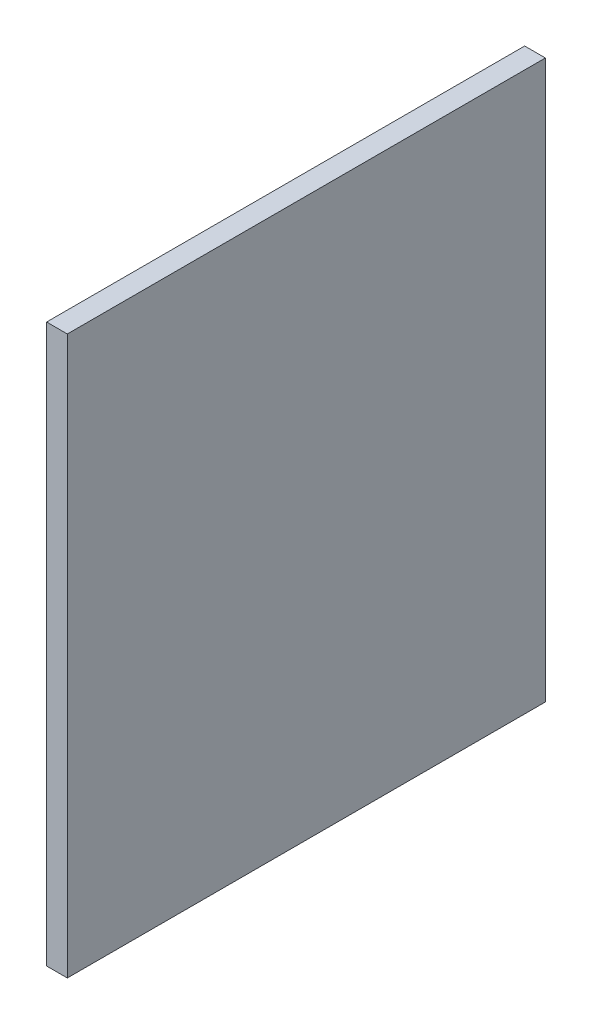
ISO-10303-21;
HEADER;
FILE_DESCRIPTION(('STEP AP214'),'2;1');
FILE_NAME('part.step','',(''),(''),'','','');
FILE_SCHEMA(('AUTOMOTIVE_DESIGN { 1 0 10303 214 1 1 1 1 }'));
ENDSEC;
DATA;
#1=APPLICATION_CONTEXT('core data for automotive mechanical design processes');
#2=APPLICATION_PROTOCOL_DEFINITION('international standard','automotive_design',2000,#1);
#3=PRODUCT_CONTEXT('',#1,'mechanical');
#4=PRODUCT('Part','Part','',(#3));
#5=PRODUCT_RELATED_PRODUCT_CATEGORY('part','',(#4));
#6=PRODUCT_DEFINITION_FORMATION('','',#4);
#7=PRODUCT_DEFINITION_CONTEXT('part definition',#1,'design');
#8=PRODUCT_DEFINITION('design','',#6,#7);
#9=PRODUCT_DEFINITION_SHAPE('','',#8);
#10=(LENGTH_UNIT() NAMED_UNIT(*) SI_UNIT(.MILLI.,.METRE.));
#11=(NAMED_UNIT(*) PLANE_ANGLE_UNIT() SI_UNIT($,.RADIAN.));
#12=(NAMED_UNIT(*) SI_UNIT($,.STERADIAN.) SOLID_ANGLE_UNIT());
#13=UNCERTAINTY_MEASURE_WITH_UNIT(LENGTH_MEASURE(1.E-05),#10,'distance_accuracy_value','');
#14=(GEOMETRIC_REPRESENTATION_CONTEXT(3) GLOBAL_UNCERTAINTY_ASSIGNED_CONTEXT((#13)) GLOBAL_UNIT_ASSIGNED_CONTEXT((#10,
#11,#12)) REPRESENTATION_CONTEXT('',''));
#15=CARTESIAN_POINT('',(0.,0.,0.));
#16=DIRECTION('',(0.,0.,1.));
#17=DIRECTION('',(1.,0.,0.));
#18=AXIS2_PLACEMENT_3D('',#15,#16,#17);
#19=CARTESIAN_POINT('',(3.302,44.45,0.));
#20=DIRECTION('',(0.,0.,1.));
#21=DIRECTION('',(1.,0.,0.));
#22=AXIS2_PLACEMENT_3D('',#19,#20,#21);
#23=PLANE('',#22);
#24=DIRECTION('',(0.,1.,0.));
#25=VECTOR('',#24,1.);
#26=CARTESIAN_POINT('',(0.,44.45,0.));
#27=LINE('',#26,#25);
#28=CARTESIAN_POINT('',(0.,-44.45,0.));
#29=VERTEX_POINT('',#28);
#30=CARTESIAN_POINT('',(0.,44.45,0.));
#31=VERTEX_POINT('',#30);
#32=EDGE_CURVE('E96',#29,#31,#27,.T.);
#33=ORIENTED_EDGE('',*,*,#32,.T.);
#34=DIRECTION('',(-1.,0.,0.));
#35=VECTOR('',#34,1.);
#36=CARTESIAN_POINT('',(3.302,44.45,0.));
#37=LINE('',#36,#35);
#38=CARTESIAN_POINT('',(3.302,44.45,0.));
#39=VERTEX_POINT('',#38);
#40=EDGE_CURVE('E11',#39,#31,#37,.T.);
#41=ORIENTED_EDGE('',*,*,#40,.F.);
#42=DIRECTION('',(0.,1.,0.));
#43=VECTOR('',#42,1.);
#44=CARTESIAN_POINT('',(3.302,44.45,0.));
#45=LINE('',#44,#43);
#46=CARTESIAN_POINT('',(3.302,-44.45,0.));
#47=VERTEX_POINT('',#46);
#48=EDGE_CURVE('E84',#47,#39,#45,.T.);
#49=ORIENTED_EDGE('',*,*,#48,.F.);
#50=DIRECTION('',(-1.,0.,0.));
#51=VECTOR('',#50,1.);
#52=CARTESIAN_POINT('',(3.302,-44.45,0.));
#53=LINE('',#52,#51);
#54=EDGE_CURVE('E92',#47,#29,#53,.T.);
#55=ORIENTED_EDGE('',*,*,#54,.T.);
#56=EDGE_LOOP('',(#33,#41,#49,#55));
#57=FACE_BOUND('',#56,.T.);
#58=ADVANCED_FACE('F33',(#57),#23,.F.);
#59=CARTESIAN_POINT('',(3.302,44.45,0.));
#60=DIRECTION('',(0.,-1.,0.));
#61=DIRECTION('',(0.,0.,-1.));
#62=AXIS2_PLACEMENT_3D('',#59,#60,#61);
#63=PLANE('',#62);
#64=DIRECTION('',(0.,0.,1.));
#65=VECTOR('',#64,1.);
#66=CARTESIAN_POINT('',(0.,44.45,0.));
#67=LINE('',#66,#65);
#68=CARTESIAN_POINT('',(0.,44.45,76.2));
#69=VERTEX_POINT('',#68);
#70=EDGE_CURVE('E88',#31,#69,#67,.T.);
#71=ORIENTED_EDGE('',*,*,#70,.T.);
#72=DIRECTION('',(-1.,0.,0.));
#73=VECTOR('',#72,1.);
#74=CARTESIAN_POINT('',(3.302,44.45,76.2));
#75=LINE('',#74,#73);
#76=CARTESIAN_POINT('',(3.302,44.45,76.2));
#77=VERTEX_POINT('',#76);
#78=EDGE_CURVE('E41',#77,#69,#75,.T.);
#79=ORIENTED_EDGE('',*,*,#78,.F.);
#80=DIRECTION('',(0.,0.,1.));
#81=VECTOR('',#80,1.);
#82=CARTESIAN_POINT('',(3.302,44.45,0.));
#83=LINE('',#82,#81);
#84=EDGE_CURVE('E79',#39,#77,#83,.T.);
#85=ORIENTED_EDGE('',*,*,#84,.F.);
#86=ORIENTED_EDGE('',*,*,#40,.T.);
#87=EDGE_LOOP('',(#71,#79,#85,#86));
#88=FACE_BOUND('',#87,.T.);
#89=ADVANCED_FACE('F87',(#88),#63,.F.);
#90=CARTESIAN_POINT('',(3.302,44.45,76.2));
#91=DIRECTION('',(0.,0.,-1.));
#92=DIRECTION('',(0.,1.,0.));
#93=AXIS2_PLACEMENT_3D('',#90,#91,#92);
#94=PLANE('',#93);
#95=DIRECTION('',(0.,-1.,0.));
#96=VECTOR('',#95,1.);
#97=CARTESIAN_POINT('',(0.,44.45,76.2));
#98=LINE('',#97,#96);
#99=CARTESIAN_POINT('',(0.,-44.45,76.2));
#100=VERTEX_POINT('',#99);
#101=EDGE_CURVE('E66',#69,#100,#98,.T.);
#102=ORIENTED_EDGE('',*,*,#101,.T.);
#103=DIRECTION('',(-1.,0.,0.));
#104=VECTOR('',#103,1.);
#105=CARTESIAN_POINT('',(3.302,-44.45,76.2));
#106=LINE('',#105,#104);
#107=CARTESIAN_POINT('',(3.302,-44.45,76.2));
#108=VERTEX_POINT('',#107);
#109=EDGE_CURVE('E89',#108,#100,#106,.T.);
#110=ORIENTED_EDGE('',*,*,#109,.F.);
#111=DIRECTION('',(0.,-1.,0.));
#112=VECTOR('',#111,1.);
#113=CARTESIAN_POINT('',(3.302,44.45,76.2));
#114=LINE('',#113,#112);
#115=EDGE_CURVE('E82',#77,#108,#114,.T.);
#116=ORIENTED_EDGE('',*,*,#115,.F.);
#117=ORIENTED_EDGE('',*,*,#78,.T.);
#118=EDGE_LOOP('',(#102,#110,#116,#117));
#119=FACE_BOUND('',#118,.T.);
#120=ADVANCED_FACE('F90',(#119),#94,.F.);
#121=CARTESIAN_POINT('',(3.302,-44.45,0.));
#122=DIRECTION('',(0.,1.,0.));
#123=DIRECTION('',(0.,0.,1.));
#124=AXIS2_PLACEMENT_3D('',#121,#122,#123);
#125=PLANE('',#124);
#126=DIRECTION('',(0.,0.,-1.));
#127=VECTOR('',#126,1.);
#128=CARTESIAN_POINT('',(0.,-44.45,0.));
#129=LINE('',#128,#127);
#130=EDGE_CURVE('E72',#100,#29,#129,.T.);
#131=ORIENTED_EDGE('',*,*,#130,.T.);
#132=ORIENTED_EDGE('',*,*,#54,.F.);
#133=DIRECTION('',(0.,0.,-1.));
#134=VECTOR('',#133,1.);
#135=CARTESIAN_POINT('',(3.302,-44.45,0.));
#136=LINE('',#135,#134);
#137=EDGE_CURVE('E49',#108,#47,#136,.T.);
#138=ORIENTED_EDGE('',*,*,#137,.F.);
#139=ORIENTED_EDGE('',*,*,#109,.T.);
#140=EDGE_LOOP('',(#131,#132,#138,#139));
#141=FACE_BOUND('',#140,.T.);
#142=ADVANCED_FACE('F103',(#141),#125,.F.);
#143=CARTESIAN_POINT('',(3.302,0.,0.));
#144=DIRECTION('',(-1.,0.,0.));
#145=DIRECTION('',(0.,0.,1.));
#146=AXIS2_PLACEMENT_3D('',#143,#144,#145);
#147=PLANE('',#146);
#148=ORIENTED_EDGE('',*,*,#48,.T.);
#149=ORIENTED_EDGE('',*,*,#84,.T.);
#150=ORIENTED_EDGE('',*,*,#115,.T.);
#151=ORIENTED_EDGE('',*,*,#137,.T.);
#152=EDGE_LOOP('',(#148,#149,#150,#151));
#153=FACE_BOUND('',#152,.T.);
#154=ADVANCED_FACE('F80',(#153),#147,.F.);
#155=CARTESIAN_POINT('',(0.,0.,0.));
#156=DIRECTION('',(-1.,0.,0.));
#157=DIRECTION('',(0.,0.,1.));
#158=AXIS2_PLACEMENT_3D('',#155,#156,#157);
#159=PLANE('',#158);
#160=ORIENTED_EDGE('',*,*,#32,.F.);
#161=ORIENTED_EDGE('',*,*,#130,.F.);
#162=ORIENTED_EDGE('',*,*,#101,.F.);
#163=ORIENTED_EDGE('',*,*,#70,.F.);
#164=EDGE_LOOP('',(#160,#161,#162,#163));
#165=FACE_BOUND('',#164,.T.);
#166=ADVANCED_FACE('F106',(#165),#159,.T.);
#167=CLOSED_SHELL('',(#58,#89,#120,#142,#154,#166));
#168=MANIFOLD_SOLID_BREP('B2',#167);
#169=ADVANCED_BREP_SHAPE_REPRESENTATION('',(#18,#168),#14);
#170=SHAPE_DEFINITION_REPRESENTATION(#9,#169);
ENDSEC;
END-ISO-10303-21;
